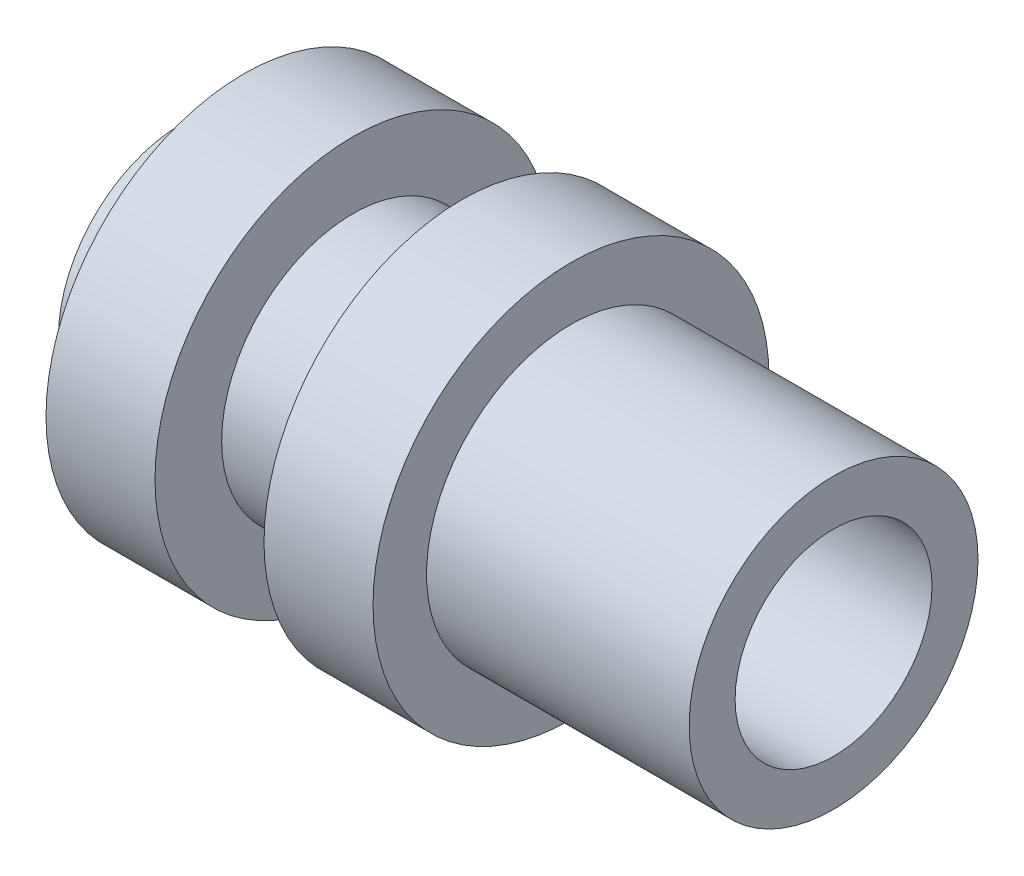
ISO-10303-21;
HEADER;
FILE_DESCRIPTION(('STEP AP214'),'2;1');
FILE_NAME('part.step','',(''),(''),'','','');
FILE_SCHEMA(('AUTOMOTIVE_DESIGN { 1 0 10303 214 1 1 1 1 }'));
ENDSEC;
DATA;
#1=APPLICATION_CONTEXT('core data for automotive mechanical design processes');
#2=APPLICATION_PROTOCOL_DEFINITION('international standard','automotive_design',2000,#1);
#3=PRODUCT_CONTEXT('',#1,'mechanical');
#4=PRODUCT('Part','Part','',(#3));
#5=PRODUCT_RELATED_PRODUCT_CATEGORY('part','',(#4));
#6=PRODUCT_DEFINITION_FORMATION('','',#4);
#7=PRODUCT_DEFINITION_CONTEXT('part definition',#1,'design');
#8=PRODUCT_DEFINITION('design','',#6,#7);
#9=PRODUCT_DEFINITION_SHAPE('','',#8);
#10=(LENGTH_UNIT() NAMED_UNIT(*) SI_UNIT(.MILLI.,.METRE.));
#11=(NAMED_UNIT(*) PLANE_ANGLE_UNIT() SI_UNIT($,.RADIAN.));
#12=(NAMED_UNIT(*) SI_UNIT($,.STERADIAN.) SOLID_ANGLE_UNIT());
#13=UNCERTAINTY_MEASURE_WITH_UNIT(LENGTH_MEASURE(1.E-05),#10,'distance_accuracy_value','');
#14=(GEOMETRIC_REPRESENTATION_CONTEXT(3) GLOBAL_UNCERTAINTY_ASSIGNED_CONTEXT((#13)) GLOBAL_UNIT_ASSIGNED_CONTEXT((#10,
#11,#12)) REPRESENTATION_CONTEXT('',''));
#15=CARTESIAN_POINT('',(0.,0.,0.));
#16=DIRECTION('',(0.,0.,1.));
#17=DIRECTION('',(1.,0.,0.));
#18=AXIS2_PLACEMENT_3D('',#15,#16,#17);
#19=CARTESIAN_POINT('',(24.9071592,0.,0.));
#20=DIRECTION('',(-1.,0.,0.));
#21=DIRECTION('',(0.,0.,1.));
#22=AXIS2_PLACEMENT_3D('',#19,#20,#21);
#23=CYLINDRICAL_SURFACE('',#22,15.07617);
#24=CARTESIAN_POINT('',(0.,0.,0.));
#25=DIRECTION('',(1.,0.,0.));
#26=DIRECTION('',(0.,0.,-1.));
#27=AXIS2_PLACEMENT_3D('',#24,#25,#26);
#28=CIRCLE('',#27,15.07617);
#29=CARTESIAN_POINT('',(0.,0.,15.07617));
#30=VERTEX_POINT('',#29);
#31=EDGE_CURVE('E44',#30,#30,#28,.T.);
#32=CARTESIAN_POINT('',(8.3023864,0.,0.));
#33=DIRECTION('',(1.,0.,0.));
#34=DIRECTION('',(0.,0.,-1.));
#35=AXIS2_PLACEMENT_3D('',#32,#33,#34);
#36=CIRCLE('',#35,15.07617);
#37=CARTESIAN_POINT('',(8.3023864,0.,15.07617));
#38=VERTEX_POINT('',#37);
#39=EDGE_CURVE('E71',#38,#38,#36,.T.);
#40=CARTESIAN_POINT('',(0.,0.,15.07617));
#41=CARTESIAN_POINT('',(0.0864831916666634,0.,15.07617));
#42=CARTESIAN_POINT('',(0.17296638333333,0.,15.07617));
#43=CARTESIAN_POINT('',(0.345932766666664,0.,15.07617));
#44=CARTESIAN_POINT('',(0.432415958333331,0.,15.07617));
#45=CARTESIAN_POINT('',(0.605382341666664,0.,15.07617));
#46=CARTESIAN_POINT('',(0.69186553333333,0.,15.07617));
#47=CARTESIAN_POINT('',(0.864831916666663,0.,15.07617));
#48=CARTESIAN_POINT('',(0.95131510833333,0.,15.07617));
#49=CARTESIAN_POINT('',(1.12428149166666,0.,15.07617));
#50=CARTESIAN_POINT('',(1.21076468333333,0.,15.07617));
#51=CARTESIAN_POINT('',(1.38373106666666,0.,15.07617));
#52=CARTESIAN_POINT('',(1.47021425833333,0.,15.07617));
#53=CARTESIAN_POINT('',(1.64318064166666,0.,15.07617));
#54=CARTESIAN_POINT('',(1.72966383333333,0.,15.07617));
#55=CARTESIAN_POINT('',(1.90263021666666,0.,15.07617));
#56=CARTESIAN_POINT('',(1.98911340833333,0.,15.07617));
#57=CARTESIAN_POINT('',(2.16207979166666,0.,15.07617));
#58=CARTESIAN_POINT('',(2.24856298333333,0.,15.07617));
#59=CARTESIAN_POINT('',(2.42152936666666,0.,15.07617));
#60=CARTESIAN_POINT('',(2.50801255833333,0.,15.07617));
#61=CARTESIAN_POINT('',(2.68097894166666,0.,15.07617));
#62=CARTESIAN_POINT('',(2.76746213333333,0.,15.07617));
#63=CARTESIAN_POINT('',(2.94042851666666,0.,15.07617));
#64=CARTESIAN_POINT('',(3.02691170833333,0.,15.07617));
#65=CARTESIAN_POINT('',(3.19987809166666,0.,15.07617));
#66=CARTESIAN_POINT('',(3.28636128333333,0.,15.07617));
#67=CARTESIAN_POINT('',(3.45932766666666,0.,15.07617));
#68=CARTESIAN_POINT('',(3.54581085833333,0.,15.07617));
#69=CARTESIAN_POINT('',(3.71877724166666,0.,15.07617));
#70=CARTESIAN_POINT('',(3.80526043333333,0.,15.07617));
#71=CARTESIAN_POINT('',(3.97822681666666,0.,15.07617));
#72=CARTESIAN_POINT('',(4.06471000833333,0.,15.07617));
#73=CARTESIAN_POINT('',(4.23767639166666,0.,15.07617));
#74=CARTESIAN_POINT('',(4.32415958333333,0.,15.07617));
#75=CARTESIAN_POINT('',(4.49712596666666,0.,15.07617));
#76=CARTESIAN_POINT('',(4.58360915833333,0.,15.07617));
#77=CARTESIAN_POINT('',(4.75657554166666,0.,15.07617));
#78=CARTESIAN_POINT('',(4.84305873333333,0.,15.07617));
#79=CARTESIAN_POINT('',(5.01602511666666,0.,15.07617));
#80=CARTESIAN_POINT('',(5.10250830833333,0.,15.07617));
#81=CARTESIAN_POINT('',(5.27547469166666,0.,15.07617));
#82=CARTESIAN_POINT('',(5.36195788333333,0.,15.07617));
#83=CARTESIAN_POINT('',(5.53492426666666,0.,15.07617));
#84=CARTESIAN_POINT('',(5.62140745833333,0.,15.07617));
#85=CARTESIAN_POINT('',(5.79437384166666,0.,15.07617));
#86=CARTESIAN_POINT('',(5.88085703333333,0.,15.07617));
#87=CARTESIAN_POINT('',(6.05382341666666,0.,15.07617));
#88=CARTESIAN_POINT('',(6.14030660833333,0.,15.07617));
#89=CARTESIAN_POINT('',(6.31327299166666,0.,15.07617));
#90=CARTESIAN_POINT('',(6.39975618333333,0.,15.07617));
#91=CARTESIAN_POINT('',(6.57272256666666,0.,15.07617));
#92=CARTESIAN_POINT('',(6.65920575833333,0.,15.07617));
#93=CARTESIAN_POINT('',(6.83217214166666,0.,15.07617));
#94=CARTESIAN_POINT('',(6.91865533333333,0.,15.07617));
#95=CARTESIAN_POINT('',(7.09162171666666,0.,15.07617));
#96=CARTESIAN_POINT('',(7.17810490833333,0.,15.07617));
#97=CARTESIAN_POINT('',(7.35107129166666,0.,15.07617));
#98=CARTESIAN_POINT('',(7.43755448333333,0.,15.07617));
#99=CARTESIAN_POINT('',(7.61052086666666,0.,15.07617));
#100=CARTESIAN_POINT('',(7.69700405833333,0.,15.07617));
#101=CARTESIAN_POINT('',(7.86997044166666,0.,15.07617));
#102=CARTESIAN_POINT('',(7.95645363333333,0.,15.07617));
#103=CARTESIAN_POINT('',(8.12942001666666,0.,15.07617));
#104=CARTESIAN_POINT('',(8.21590320833333,0.,15.07617));
#105=CARTESIAN_POINT('',(8.3023864,0.,15.07617));
#106=B_SPLINE_CURVE_WITH_KNOTS('',3,(#40,#41,#42,#43,#44,#45,#46,#47,#48,#49,#50,#51,#52,#53,
#54,#55,#56,#57,#58,#59,#60,#61,#62,#63,#64,#65,#66,#67,#68,#69,#70,#71,#72,#73,#74,#75,#76,#77,
#78,#79,#80,#81,#82,#83,#84,#85,#86,#87,#88,#89,#90,#91,#92,#93,#94,#95,#96,#97,#98,#99,#100,
#101,#102,#103,#104,#105),.UNSPECIFIED.,.F.,.F.,(4,2,2,2,2,2,2,2,2,2,2,2,2,2,2,2,2,2,2,2,2,2,2,
2,2,2,2,2,2,2,2,2,4),(0.,0.259449575000001,0.518899150000002,0.778348724999999,1.0377983,
1.297247875,1.55669745,1.816147025,2.0755966,2.335046175,2.59449575,2.853945325,3.1133949,
3.372844475,3.63229405,3.891743625,4.1511932,4.410642775,4.67009235,4.929541925,5.1889915,
5.448441075,5.70789065,5.967340225,6.2267898,6.486239375,6.74568895,7.005138525,7.2645881,
7.524037675,7.78348725,8.042936825,8.3023864),.UNSPECIFIED.);
#107=EDGE_CURVE('BSEAM33',#30,#38,#106,.T.);
#108=ORIENTED_EDGE('',*,*,#31,.T.);
#109=ORIENTED_EDGE('',*,*,#39,.F.);
#110=ORIENTED_EDGE('',*,*,#107,.T.);
#111=ORIENTED_EDGE('',*,*,#107,.F.);
#112=EDGE_LOOP('',(#108,#110,#109,#111));
#113=FACE_BOUND('',#112,.T.);
#114=ADVANCED_FACE('F33',(#113),#23,.T.);
#115=CARTESIAN_POINT('',(0.,0.,0.));
#116=DIRECTION('',(1.,0.,0.));
#117=DIRECTION('',(0.,0.,-1.));
#118=AXIS2_PLACEMENT_3D('',#115,#116,#117);
#119=PLANE('',#118);
#120=CARTESIAN_POINT('',(0.,0.,0.));
#121=DIRECTION('',(1.,0.,0.));
#122=DIRECTION('',(0.,0.,-1.));
#123=AXIS2_PLACEMENT_3D('',#120,#121,#122);
#124=CIRCLE('',#123,9.3853);
#125=CARTESIAN_POINT('',(0.,0.,-9.3853));
#126=VERTEX_POINT('',#125);
#127=EDGE_CURVE('E10',#126,#126,#124,.F.);
#128=ORIENTED_EDGE('',*,*,#127,.F.);
#129=EDGE_LOOP('',(#128));
#130=FACE_BOUND('',#129,.T.);
#131=ORIENTED_EDGE('',*,*,#31,.F.);
#132=EDGE_LOOP('',(#131));
#133=FACE_BOUND('',#132,.T.);
#134=ADVANCED_FACE('F96',(#130,#133),#119,.F.);
#135=CARTESIAN_POINT('',(-4.7498,0.,0.));
#136=DIRECTION('',(-1.,0.,0.));
#137=DIRECTION('',(0.,0.,1.));
#138=AXIS2_PLACEMENT_3D('',#135,#136,#137);
#139=PLANE('',#138);
#140=CARTESIAN_POINT('',(-4.7498,0.,0.));
#141=DIRECTION('',(-1.,0.,0.));
#142=DIRECTION('',(0.,0.,1.));
#143=AXIS2_PLACEMENT_3D('',#140,#141,#142);
#144=CIRCLE('',#143,9.3853);
#145=CARTESIAN_POINT('',(-4.7498,0.,9.3853));
#146=VERTEX_POINT('',#145);
#147=EDGE_CURVE('E49',#146,#146,#144,.T.);
#148=ORIENTED_EDGE('',*,*,#147,.T.);
#149=EDGE_LOOP('',(#148));
#150=FACE_BOUND('',#149,.T.);
#151=CARTESIAN_POINT('',(-4.7498,0.,0.));
#152=DIRECTION('',(-1.,0.,0.));
#153=DIRECTION('',(0.,0.,1.));
#154=AXIS2_PLACEMENT_3D('',#151,#152,#153);
#155=CIRCLE('',#154,4.5847);
#156=CARTESIAN_POINT('',(-4.7498,0.,4.5847));
#157=VERTEX_POINT('',#156);
#158=EDGE_CURVE('E53',#157,#157,#155,.T.);
#159=ORIENTED_EDGE('',*,*,#158,.F.);
#160=EDGE_LOOP('',(#159));
#161=FACE_BOUND('',#160,.T.);
#162=ADVANCED_FACE('F101',(#150,#161),#139,.T.);
#163=CARTESIAN_POINT('',(-4.7498,0.,0.));
#164=DIRECTION('',(1.,0.,0.));
#165=DIRECTION('',(0.,0.,-1.));
#166=AXIS2_PLACEMENT_3D('',#163,#164,#165);
#167=CYLINDRICAL_SURFACE('',#166,9.3853);
#168=ORIENTED_EDGE('',*,*,#147,.F.);
#169=EDGE_LOOP('',(#168));
#170=FACE_BOUND('',#169,.T.);
#171=ORIENTED_EDGE('',*,*,#127,.T.);
#172=EDGE_LOOP('',(#171));
#173=FACE_BOUND('',#172,.T.);
#174=ADVANCED_FACE('F140',(#170,#173),#167,.T.);
#175=CARTESIAN_POINT('',(-4.7498,0.,0.));
#176=DIRECTION('',(1.,0.,0.));
#177=DIRECTION('',(0.,0.,-1.));
#178=AXIS2_PLACEMENT_3D('',#175,#176,#177);
#179=CYLINDRICAL_SURFACE('',#178,4.5847);
#180=ORIENTED_EDGE('',*,*,#158,.T.);
#181=EDGE_LOOP('',(#180));
#182=FACE_BOUND('',#181,.T.);
#183=CARTESIAN_POINT('',(0.,0.,0.));
#184=DIRECTION('',(-1.,0.,0.));
#185=DIRECTION('',(0.,0.,1.));
#186=AXIS2_PLACEMENT_3D('',#183,#184,#185);
#187=CIRCLE('',#186,4.5847);
#188=CARTESIAN_POINT('',(0.,0.,4.5847));
#189=VERTEX_POINT('',#188);
#190=EDGE_CURVE('E54',#189,#189,#187,.T.);
#191=ORIENTED_EDGE('',*,*,#190,.F.);
#192=EDGE_LOOP('',(#191));
#193=FACE_BOUND('',#192,.T.);
#194=ADVANCED_FACE('F137',(#182,#193),#179,.F.);
#195=ORIENTED_EDGE('',*,*,#190,.T.);
#196=EDGE_LOOP('',(#195));
#197=FACE_BOUND('',#196,.T.);
#198=ADVANCED_FACE('F91',(#197),#119,.F.);
#199=CARTESIAN_POINT('',(8.3023864,0.,0.));
#200=DIRECTION('',(1.,0.,0.));
#201=DIRECTION('',(0.,0.,-1.));
#202=AXIS2_PLACEMENT_3D('',#199,#200,#201);
#203=PLANE('',#202);
#204=CARTESIAN_POINT('',(8.3023864,0.,0.));
#205=DIRECTION('',(1.,0.,0.));
#206=DIRECTION('',(0.,0.,-1.));
#207=AXIS2_PLACEMENT_3D('',#204,#205,#206);
#208=CIRCLE('',#207,10.);
#209=CARTESIAN_POINT('',(8.3023864,0.,-10.));
#210=VERTEX_POINT('',#209);
#211=EDGE_CURVE('E75',#210,#210,#208,.T.);
#212=ORIENTED_EDGE('',*,*,#211,.F.);
#213=EDGE_LOOP('',(#212));
#214=FACE_BOUND('',#213,.T.);
#215=ORIENTED_EDGE('',*,*,#39,.T.);
#216=EDGE_LOOP('',(#215));
#217=FACE_BOUND('',#216,.T.);
#218=ADVANCED_FACE('F87',(#214,#217),#203,.T.);
#219=CARTESIAN_POINT('',(16.6047728,0.,0.));
#220=DIRECTION('',(1.,0.,0.));
#221=DIRECTION('',(0.,0.,-1.));
#222=AXIS2_PLACEMENT_3D('',#219,#220,#221);
#223=PLANE('',#222);
#224=CARTESIAN_POINT('',(16.6047728,0.,0.));
#225=DIRECTION('',(1.,0.,0.));
#226=DIRECTION('',(0.,0.,-1.));
#227=AXIS2_PLACEMENT_3D('',#224,#225,#226);
#228=CIRCLE('',#227,10.);
#229=CARTESIAN_POINT('',(16.6047728,0.,-10.));
#230=VERTEX_POINT('',#229);
#231=EDGE_CURVE('E78',#230,#230,#228,.T.);
#232=ORIENTED_EDGE('',*,*,#231,.T.);
#233=EDGE_LOOP('',(#232));
#234=FACE_BOUND('',#233,.T.);
#235=CARTESIAN_POINT('',(16.6047728,0.,0.));
#236=DIRECTION('',(1.,0.,0.));
#237=DIRECTION('',(0.,0.,-1.));
#238=AXIS2_PLACEMENT_3D('',#235,#236,#237);
#239=CIRCLE('',#238,15.07617);
#240=CARTESIAN_POINT('',(16.6047728,0.,15.07617));
#241=VERTEX_POINT('',#240);
#242=EDGE_CURVE('E72',#241,#241,#239,.T.);
#243=ORIENTED_EDGE('',*,*,#242,.F.);
#244=EDGE_LOOP('',(#243));
#245=FACE_BOUND('',#244,.T.);
#246=ADVANCED_FACE('F90',(#234,#245),#223,.F.);
#247=CARTESIAN_POINT('',(8.3023864,0.,0.));
#248=DIRECTION('',(1.,0.,0.));
#249=DIRECTION('',(0.,0.,-1.));
#250=AXIS2_PLACEMENT_3D('',#247,#248,#249);
#251=CYLINDRICAL_SURFACE('',#250,10.);
#252=ORIENTED_EDGE('',*,*,#211,.T.);
#253=EDGE_LOOP('',(#252));
#254=FACE_BOUND('',#253,.T.);
#255=ORIENTED_EDGE('',*,*,#231,.F.);
#256=EDGE_LOOP('',(#255));
#257=FACE_BOUND('',#256,.T.);
#258=ADVANCED_FACE('F84',(#254,#257),#251,.T.);
#259=CARTESIAN_POINT('',(6.1571592,0.,0.));
#260=DIRECTION('',(1.,0.,0.));
#261=DIRECTION('',(0.,0.,-1.));
#262=AXIS2_PLACEMENT_3D('',#259,#260,#261);
#263=PLANE('',#262);
#264=CARTESIAN_POINT('',(6.1571592,0.,0.));
#265=DIRECTION('',(1.,0.,0.));
#266=DIRECTION('',(0.,0.,-1.));
#267=AXIS2_PLACEMENT_3D('',#264,#265,#266);
#268=CIRCLE('',#267,7.5);
#269=CARTESIAN_POINT('',(6.1571592,0.,-7.5));
#270=VERTEX_POINT('',#269);
#271=EDGE_CURVE('E57',#270,#270,#268,.T.);
#272=ORIENTED_EDGE('',*,*,#271,.T.);
#273=EDGE_LOOP('',(#272));
#274=FACE_BOUND('',#273,.T.);
#275=ADVANCED_FACE('F120',(#274),#263,.T.);
#276=CARTESIAN_POINT('',(6.1571592,0.,0.));
#277=DIRECTION('',(1.,0.,0.));
#278=DIRECTION('',(0.,0.,-1.));
#279=AXIS2_PLACEMENT_3D('',#276,#277,#278);
#280=CYLINDRICAL_SURFACE('',#279,7.5);
#281=ORIENTED_EDGE('',*,*,#271,.F.);
#282=EDGE_LOOP('',(#281));
#283=FACE_BOUND('',#282,.T.);
#284=CARTESIAN_POINT('',(44.9071592,0.,0.));
#285=DIRECTION('',(1.,0.,0.));
#286=DIRECTION('',(0.,0.,-1.));
#287=AXIS2_PLACEMENT_3D('',#284,#285,#286);
#288=CIRCLE('',#287,7.5);
#289=CARTESIAN_POINT('',(44.9071592,0.,-7.5));
#290=VERTEX_POINT('',#289);
#291=EDGE_CURVE('E66',#290,#290,#288,.T.);
#292=ORIENTED_EDGE('',*,*,#291,.T.);
#293=EDGE_LOOP('',(#292));
#294=FACE_BOUND('',#293,.T.);
#295=ADVANCED_FACE('F126',(#283,#294),#280,.F.);
#296=CARTESIAN_POINT('',(44.9071592,0.,0.));
#297=DIRECTION('',(1.,0.,0.));
#298=DIRECTION('',(0.,0.,-1.));
#299=AXIS2_PLACEMENT_3D('',#296,#297,#298);
#300=PLANE('',#299);
#301=CARTESIAN_POINT('',(44.9071592,0.,0.));
#302=DIRECTION('',(1.,0.,0.));
#303=DIRECTION('',(0.,0.,-1.));
#304=AXIS2_PLACEMENT_3D('',#301,#302,#303);
#305=CIRCLE('',#304,11.);
#306=CARTESIAN_POINT('',(44.9071592,0.,-11.));
#307=VERTEX_POINT('',#306);
#308=EDGE_CURVE('E62',#307,#307,#305,.T.);
#309=ORIENTED_EDGE('',*,*,#308,.T.);
#310=EDGE_LOOP('',(#309));
#311=FACE_BOUND('',#310,.T.);
#312=ORIENTED_EDGE('',*,*,#291,.F.);
#313=EDGE_LOOP('',(#312));
#314=FACE_BOUND('',#313,.T.);
#315=ADVANCED_FACE('F123',(#311,#314),#300,.T.);
#316=CARTESIAN_POINT('',(44.9071592,0.,0.));
#317=DIRECTION('',(-1.,0.,0.));
#318=DIRECTION('',(0.,0.,1.));
#319=AXIS2_PLACEMENT_3D('',#316,#317,#318);
#320=CYLINDRICAL_SURFACE('',#319,11.);
#321=ORIENTED_EDGE('',*,*,#308,.F.);
#322=EDGE_LOOP('',(#321));
#323=FACE_BOUND('',#322,.T.);
#324=CARTESIAN_POINT('',(24.9071592,0.,0.));
#325=DIRECTION('',(1.,0.,0.));
#326=DIRECTION('',(0.,0.,-1.));
#327=AXIS2_PLACEMENT_3D('',#324,#325,#326);
#328=CIRCLE('',#327,11.);
#329=CARTESIAN_POINT('',(24.9071592,0.,-11.));
#330=VERTEX_POINT('',#329);
#331=EDGE_CURVE('E63',#330,#330,#328,.T.);
#332=ORIENTED_EDGE('',*,*,#331,.T.);
#333=EDGE_LOOP('',(#332));
#334=FACE_BOUND('',#333,.T.);
#335=ADVANCED_FACE('F109',(#323,#334),#320,.T.);
#336=CARTESIAN_POINT('',(24.9071592,0.,0.));
#337=DIRECTION('',(1.,0.,0.));
#338=DIRECTION('',(0.,0.,-1.));
#339=AXIS2_PLACEMENT_3D('',#336,#337,#338);
#340=PLANE('',#339);
#341=CARTESIAN_POINT('',(24.9071592,0.,0.));
#342=DIRECTION('',(1.,0.,0.));
#343=DIRECTION('',(0.,0.,-1.));
#344=AXIS2_PLACEMENT_3D('',#341,#342,#343);
#345=CIRCLE('',#344,15.07617);
#346=CARTESIAN_POINT('',(24.9071592,0.,15.07617));
#347=VERTEX_POINT('',#346);
#348=EDGE_CURVE('E40',#347,#347,#345,.T.);
#349=ORIENTED_EDGE('',*,*,#348,.T.);
#350=EDGE_LOOP('',(#349));
#351=FACE_BOUND('',#350,.T.);
#352=ORIENTED_EDGE('',*,*,#331,.F.);
#353=EDGE_LOOP('',(#352));
#354=FACE_BOUND('',#353,.T.);
#355=ADVANCED_FACE('F104',(#351,#354),#340,.T.);
#356=CARTESIAN_POINT('',(16.6047728,0.,15.07617));
#357=CARTESIAN_POINT('',(16.6912559916667,0.,15.07617));
#358=CARTESIAN_POINT('',(16.7777391833333,0.,15.07617));
#359=CARTESIAN_POINT('',(16.9507055666667,0.,15.07617));
#360=CARTESIAN_POINT('',(17.0371887583333,0.,15.07617));
#361=CARTESIAN_POINT('',(17.2101551416667,0.,15.07617));
#362=CARTESIAN_POINT('',(17.2966383333333,0.,15.07617));
#363=CARTESIAN_POINT('',(17.4696047166667,0.,15.07617));
#364=CARTESIAN_POINT('',(17.5560879083333,0.,15.07617));
#365=CARTESIAN_POINT('',(17.7290542916667,0.,15.07617));
#366=CARTESIAN_POINT('',(17.8155374833333,0.,15.07617));
#367=CARTESIAN_POINT('',(17.9885038666667,0.,15.07617));
#368=CARTESIAN_POINT('',(18.0749870583333,0.,15.07617));
#369=CARTESIAN_POINT('',(18.2479534416667,0.,15.07617));
#370=CARTESIAN_POINT('',(18.3344366333333,0.,15.07617));
#371=CARTESIAN_POINT('',(18.5074030166667,0.,15.07617));
#372=CARTESIAN_POINT('',(18.5938862083333,0.,15.07617));
#373=CARTESIAN_POINT('',(18.7668525916667,0.,15.07617));
#374=CARTESIAN_POINT('',(18.8533357833333,0.,15.07617));
#375=CARTESIAN_POINT('',(19.0263021666667,0.,15.07617));
#376=CARTESIAN_POINT('',(19.1127853583333,0.,15.07617));
#377=CARTESIAN_POINT('',(19.2857517416667,0.,15.07617));
#378=CARTESIAN_POINT('',(19.3722349333333,0.,15.07617));
#379=CARTESIAN_POINT('',(19.5452013166667,0.,15.07617));
#380=CARTESIAN_POINT('',(19.6316845083333,0.,15.07617));
#381=CARTESIAN_POINT('',(19.8046508916667,0.,15.07617));
#382=CARTESIAN_POINT('',(19.8911340833333,0.,15.07617));
#383=CARTESIAN_POINT('',(20.0641004666667,0.,15.07617));
#384=CARTESIAN_POINT('',(20.1505836583333,0.,15.07617));
#385=CARTESIAN_POINT('',(20.3235500416667,0.,15.07617));
#386=CARTESIAN_POINT('',(20.4100332333333,0.,15.07617));
#387=CARTESIAN_POINT('',(20.5829996166667,0.,15.07617));
#388=CARTESIAN_POINT('',(20.6694828083333,0.,15.07617));
#389=CARTESIAN_POINT('',(20.8424491916667,0.,15.07617));
#390=CARTESIAN_POINT('',(20.9289323833333,0.,15.07617));
#391=CARTESIAN_POINT('',(21.1018987666667,0.,15.07617));
#392=CARTESIAN_POINT('',(21.1883819583333,0.,15.07617));
#393=CARTESIAN_POINT('',(21.3613483416667,0.,15.07617));
#394=CARTESIAN_POINT('',(21.4478315333333,0.,15.07617));
#395=CARTESIAN_POINT('',(21.6207979166667,0.,15.07617));
#396=CARTESIAN_POINT('',(21.7072811083333,0.,15.07617));
#397=CARTESIAN_POINT('',(21.8802474916667,0.,15.07617));
#398=CARTESIAN_POINT('',(21.9667306833333,0.,15.07617));
#399=CARTESIAN_POINT('',(22.1396970666667,0.,15.07617));
#400=CARTESIAN_POINT('',(22.2261802583333,0.,15.07617));
#401=CARTESIAN_POINT('',(22.3991466416667,0.,15.07617));
#402=CARTESIAN_POINT('',(22.4856298333333,0.,15.07617));
#403=CARTESIAN_POINT('',(22.6585962166667,0.,15.07617));
#404=CARTESIAN_POINT('',(22.7450794083333,0.,15.07617));
#405=CARTESIAN_POINT('',(22.9180457916667,0.,15.07617));
#406=CARTESIAN_POINT('',(23.0045289833333,0.,15.07617));
#407=CARTESIAN_POINT('',(23.1774953666667,0.,15.07617));
#408=CARTESIAN_POINT('',(23.2639785583333,0.,15.07617));
#409=CARTESIAN_POINT('',(23.4369449416667,0.,15.07617));
#410=CARTESIAN_POINT('',(23.5234281333333,0.,15.07617));
#411=CARTESIAN_POINT('',(23.6963945166667,0.,15.07617));
#412=CARTESIAN_POINT('',(23.7828777083333,0.,15.07617));
#413=CARTESIAN_POINT('',(23.9558440916667,0.,15.07617));
#414=CARTESIAN_POINT('',(24.0423272833333,0.,15.07617));
#415=CARTESIAN_POINT('',(24.2152936666667,0.,15.07617));
#416=CARTESIAN_POINT('',(24.3017768583333,0.,15.07617));
#417=CARTESIAN_POINT('',(24.4747432416667,0.,15.07617));
#418=CARTESIAN_POINT('',(24.5612264333333,0.,15.07617));
#419=CARTESIAN_POINT('',(24.7341928166667,0.,15.07617));
#420=CARTESIAN_POINT('',(24.8206760083333,0.,15.07617));
#421=CARTESIAN_POINT('',(24.9071592,0.,15.07617));
#422=B_SPLINE_CURVE_WITH_KNOTS('',3,(#356,#357,#358,#359,#360,#361,#362,#363,#364,#365,#366,
#367,#368,#369,#370,#371,#372,#373,#374,#375,#376,#377,#378,#379,#380,#381,#382,#383,#384,#385,
#386,#387,#388,#389,#390,#391,#392,#393,#394,#395,#396,#397,#398,#399,#400,#401,#402,#403,#404,
#405,#406,#407,#408,#409,#410,#411,#412,#413,#414,#415,#416,#417,#418,#419,#420,#421),
.UNSPECIFIED.,.F.,.F.,(4,2,2,2,2,2,2,2,2,2,2,2,2,2,2,2,2,2,2,2,2,2,2,2,2,2,2,2,2,2,2,2,4),(0.,
0.259449575000001,0.518899149999998,0.778348724999996,1.0377983,1.297247875,1.55669745,
1.816147025,2.0755966,2.335046175,2.59449575,2.853945325,3.1133949,3.372844475,3.63229405,
3.891743625,4.1511932,4.410642775,4.67009235,4.929541925,5.1889915,5.448441075,5.70789065,
5.967340225,6.2267898,6.486239375,6.74568895,7.005138525,7.2645881,7.524037675,7.78348725,
8.042936825,8.3023864),.UNSPECIFIED.);
#423=EDGE_CURVE('BSEAM35',#241,#347,#422,.T.);
#424=ORIENTED_EDGE('',*,*,#242,.T.);
#425=ORIENTED_EDGE('',*,*,#348,.F.);
#426=ORIENTED_EDGE('',*,*,#423,.T.);
#427=ORIENTED_EDGE('',*,*,#423,.F.);
#428=EDGE_LOOP('',(#424,#426,#425,#427));
#429=FACE_BOUND('',#428,.T.);
#430=ADVANCED_FACE('F35',(#429),#23,.T.);
#431=CLOSED_SHELL('',(#114,#134,#162,#174,#194,#198,#218,#246,#258,#275,#295,#315,#335,#355,#430));
#432=MANIFOLD_SOLID_BREP('B2',#431);
#433=ADVANCED_BREP_SHAPE_REPRESENTATION('',(#18,#432),#14);
#434=SHAPE_DEFINITION_REPRESENTATION(#9,#433);
ENDSEC;
END-ISO-10303-21;
